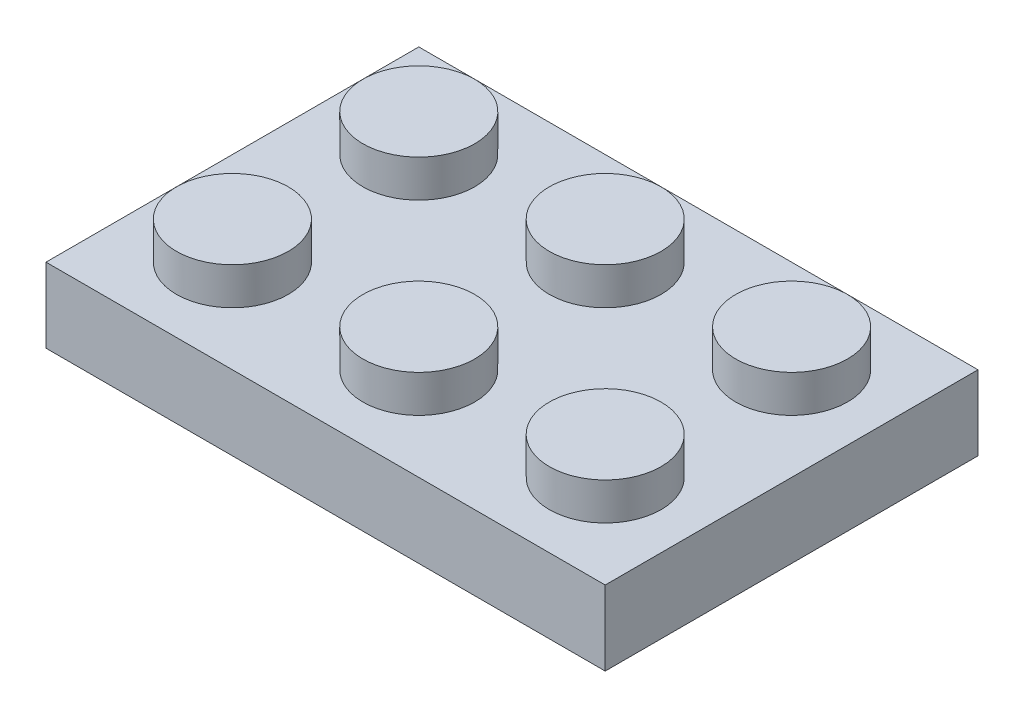
ISO-10303-21;
HEADER;
FILE_DESCRIPTION(('STEP AP214'),'2;1');
FILE_NAME('part.step','',(''),(''),'','','');
FILE_SCHEMA(('AUTOMOTIVE_DESIGN { 1 0 10303 214 1 1 1 1 }'));
ENDSEC;
DATA;
#1=APPLICATION_CONTEXT('core data for automotive mechanical design processes');
#2=APPLICATION_PROTOCOL_DEFINITION('international standard','automotive_design',2000,#1);
#3=PRODUCT_CONTEXT('',#1,'mechanical');
#4=PRODUCT('Part','Part','',(#3));
#5=PRODUCT_RELATED_PRODUCT_CATEGORY('part','',(#4));
#6=PRODUCT_DEFINITION_FORMATION('','',#4);
#7=PRODUCT_DEFINITION_CONTEXT('part definition',#1,'design');
#8=PRODUCT_DEFINITION('design','',#6,#7);
#9=PRODUCT_DEFINITION_SHAPE('','',#8);
#10=(LENGTH_UNIT() NAMED_UNIT(*) SI_UNIT(.MILLI.,.METRE.));
#11=(NAMED_UNIT(*) PLANE_ANGLE_UNIT() SI_UNIT($,.RADIAN.));
#12=(NAMED_UNIT(*) SI_UNIT($,.STERADIAN.) SOLID_ANGLE_UNIT());
#13=UNCERTAINTY_MEASURE_WITH_UNIT(LENGTH_MEASURE(1.E-05),#10,'distance_accuracy_value','');
#14=(GEOMETRIC_REPRESENTATION_CONTEXT(3) GLOBAL_UNCERTAINTY_ASSIGNED_CONTEXT((#13)) GLOBAL_UNIT_ASSIGNED_CONTEXT((#10,
#11,#12)) REPRESENTATION_CONTEXT('',''));
#15=CARTESIAN_POINT('',(0.,0.,0.));
#16=DIRECTION('',(0.,0.,1.));
#17=DIRECTION('',(1.,0.,0.));
#18=AXIS2_PLACEMENT_3D('',#15,#16,#17);
#19=CARTESIAN_POINT('',(20.,1.6,4.));
#20=DIRECTION('',(-1.,0.,0.));
#21=DIRECTION('',(0.,0.,1.));
#22=AXIS2_PLACEMENT_3D('',#19,#20,#21);
#23=PLANE('',#22);
#24=DIRECTION('',(0.,0.,-1.));
#25=VECTOR('',#24,1.);
#26=CARTESIAN_POINT('',(20.,0.,4.));
#27=LINE('',#26,#25);
#28=CARTESIAN_POINT('',(20.,0.,12.));
#29=VERTEX_POINT('',#28);
#30=CARTESIAN_POINT('',(20.,0.,-4.));
#31=VERTEX_POINT('',#30);
#32=EDGE_CURVE('E191',#29,#31,#27,.T.);
#33=ORIENTED_EDGE('',*,*,#32,.T.);
#34=DIRECTION('',(0.,-1.,0.));
#35=VECTOR('',#34,1.);
#36=CARTESIAN_POINT('',(20.,1.6,-4.));
#37=LINE('',#36,#35);
#38=CARTESIAN_POINT('',(20.,3.2,-4.));
#39=VERTEX_POINT('',#38);
#40=EDGE_CURVE('E162',#39,#31,#37,.T.);
#41=ORIENTED_EDGE('',*,*,#40,.F.);
#42=DIRECTION('',(0.,0.,-1.));
#43=VECTOR('',#42,1.);
#44=CARTESIAN_POINT('',(20.,3.2,4.));
#45=LINE('',#44,#43);
#46=CARTESIAN_POINT('',(20.,3.2,12.));
#47=VERTEX_POINT('',#46);
#48=EDGE_CURVE('E11',#47,#39,#45,.T.);
#49=ORIENTED_EDGE('',*,*,#48,.F.);
#50=DIRECTION('',(0.,1.,0.));
#51=VECTOR('',#50,1.);
#52=CARTESIAN_POINT('',(20.,1.6,12.));
#53=LINE('',#52,#51);
#54=EDGE_CURVE('E143',#29,#47,#53,.T.);
#55=ORIENTED_EDGE('',*,*,#54,.F.);
#56=EDGE_LOOP('',(#33,#41,#49,#55));
#57=FACE_BOUND('',#56,.T.);
#58=ADVANCED_FACE('F17',(#57),#23,.F.);
#59=CARTESIAN_POINT('',(8.,3.2,4.));
#60=DIRECTION('',(0.,-1.,0.));
#61=DIRECTION('',(0.,0.,-1.));
#62=AXIS2_PLACEMENT_3D('',#59,#60,#61);
#63=PLANE('',#62);
#64=ORIENTED_EDGE('',*,*,#48,.T.);
#65=DIRECTION('',(1.,0.,0.));
#66=VECTOR('',#65,1.);
#67=CARTESIAN_POINT('',(8.,3.2,-4.));
#68=LINE('',#67,#66);
#69=CARTESIAN_POINT('',(-4.,3.2,-4.));
#70=VERTEX_POINT('',#69);
#71=EDGE_CURVE('E148',#70,#39,#68,.T.);
#72=ORIENTED_EDGE('',*,*,#71,.F.);
#73=DIRECTION('',(0.,0.,-1.));
#74=VECTOR('',#73,1.);
#75=CARTESIAN_POINT('',(-4.,3.2,4.));
#76=LINE('',#75,#74);
#77=CARTESIAN_POINT('',(-4.,3.2,12.));
#78=VERTEX_POINT('',#77);
#79=EDGE_CURVE('E27',#78,#70,#76,.T.);
#80=ORIENTED_EDGE('',*,*,#79,.F.);
#81=DIRECTION('',(-1.,0.,0.));
#82=VECTOR('',#81,1.);
#83=CARTESIAN_POINT('',(8.,3.2,12.));
#84=LINE('',#83,#82);
#85=EDGE_CURVE('E146',#47,#78,#84,.T.);
#86=ORIENTED_EDGE('',*,*,#85,.F.);
#87=EDGE_LOOP('',(#64,#72,#80,#86));
#88=FACE_BOUND('',#87,.T.);
#89=CARTESIAN_POINT('',(0.,3.2,0.));
#90=DIRECTION('',(0.,-1.,0.));
#91=DIRECTION('',(1.,0.,0.));
#92=AXIS2_PLACEMENT_3D('',#89,#90,#91);
#93=CIRCLE('',#92,2.4);
#94=CARTESIAN_POINT('',(-2.4,3.2,0.));
#95=VERTEX_POINT('',#94);
#96=EDGE_CURVE('E147',#95,#95,#93,.T.);
#97=ORIENTED_EDGE('',*,*,#96,.T.);
#98=EDGE_LOOP('',(#97));
#99=FACE_BOUND('',#98,.T.);
#100=CARTESIAN_POINT('',(0.,3.2,8.));
#101=DIRECTION('',(0.,-1.,0.));
#102=DIRECTION('',(1.,0.,0.));
#103=AXIS2_PLACEMENT_3D('',#100,#101,#102);
#104=CIRCLE('',#103,2.4);
#105=CARTESIAN_POINT('',(-2.4,3.2,8.));
#106=VERTEX_POINT('',#105);
#107=EDGE_CURVE('E21',#106,#106,#104,.T.);
#108=ORIENTED_EDGE('',*,*,#107,.T.);
#109=EDGE_LOOP('',(#108));
#110=FACE_BOUND('',#109,.T.);
#111=CARTESIAN_POINT('',(8.,3.2,0.));
#112=DIRECTION('',(0.,-1.,0.));
#113=DIRECTION('',(1.,0.,0.));
#114=AXIS2_PLACEMENT_3D('',#111,#112,#113);
#115=CIRCLE('',#114,2.4);
#116=CARTESIAN_POINT('',(5.6,3.2,0.));
#117=VERTEX_POINT('',#116);
#118=EDGE_CURVE('E171',#117,#117,#115,.T.);
#119=ORIENTED_EDGE('',*,*,#118,.T.);
#120=EDGE_LOOP('',(#119));
#121=FACE_BOUND('',#120,.T.);
#122=CARTESIAN_POINT('',(8.,3.2,8.));
#123=DIRECTION('',(0.,-1.,0.));
#124=DIRECTION('',(1.,0.,0.));
#125=AXIS2_PLACEMENT_3D('',#122,#123,#124);
#126=CIRCLE('',#125,2.4);
#127=CARTESIAN_POINT('',(5.6,3.2,8.));
#128=VERTEX_POINT('',#127);
#129=EDGE_CURVE('E189',#128,#128,#126,.T.);
#130=ORIENTED_EDGE('',*,*,#129,.T.);
#131=EDGE_LOOP('',(#130));
#132=FACE_BOUND('',#131,.T.);
#133=CARTESIAN_POINT('',(16.,3.2,0.));
#134=DIRECTION('',(0.,-1.,0.));
#135=DIRECTION('',(1.,0.,0.));
#136=AXIS2_PLACEMENT_3D('',#133,#134,#135);
#137=CIRCLE('',#136,2.4);
#138=CARTESIAN_POINT('',(13.6,3.2,0.));
#139=VERTEX_POINT('',#138);
#140=EDGE_CURVE('E140',#139,#139,#137,.T.);
#141=ORIENTED_EDGE('',*,*,#140,.T.);
#142=EDGE_LOOP('',(#141));
#143=FACE_BOUND('',#142,.T.);
#144=CARTESIAN_POINT('',(16.,3.2,8.));
#145=DIRECTION('',(0.,-1.,0.));
#146=DIRECTION('',(1.,0.,0.));
#147=AXIS2_PLACEMENT_3D('',#144,#145,#146);
#148=CIRCLE('',#147,2.4);
#149=CARTESIAN_POINT('',(13.6,3.2,8.));
#150=VERTEX_POINT('',#149);
#151=EDGE_CURVE('E205',#150,#150,#148,.T.);
#152=ORIENTED_EDGE('',*,*,#151,.T.);
#153=EDGE_LOOP('',(#152));
#154=FACE_BOUND('',#153,.T.);
#155=ADVANCED_FACE('F235',(#88,#99,#110,#121,#132,#143,#154),#63,.F.);
#156=CARTESIAN_POINT('',(-4.,1.6,4.));
#157=DIRECTION('',(1.,0.,0.));
#158=DIRECTION('',(0.,0.,-1.));
#159=AXIS2_PLACEMENT_3D('',#156,#157,#158);
#160=PLANE('',#159);
#161=ORIENTED_EDGE('',*,*,#79,.T.);
#162=DIRECTION('',(0.,1.,0.));
#163=VECTOR('',#162,1.);
#164=CARTESIAN_POINT('',(-4.,1.6,-4.));
#165=LINE('',#164,#163);
#166=CARTESIAN_POINT('',(-4.,0.,-4.));
#167=VERTEX_POINT('',#166);
#168=EDGE_CURVE('E152',#167,#70,#165,.T.);
#169=ORIENTED_EDGE('',*,*,#168,.F.);
#170=DIRECTION('',(0.,0.,-1.));
#171=VECTOR('',#170,1.);
#172=CARTESIAN_POINT('',(-4.,0.,4.));
#173=LINE('',#172,#171);
#174=CARTESIAN_POINT('',(-4.,0.,12.));
#175=VERTEX_POINT('',#174);
#176=EDGE_CURVE('E151',#175,#167,#173,.T.);
#177=ORIENTED_EDGE('',*,*,#176,.F.);
#178=DIRECTION('',(0.,-1.,0.));
#179=VECTOR('',#178,1.);
#180=CARTESIAN_POINT('',(-4.,1.6,12.));
#181=LINE('',#180,#179);
#182=EDGE_CURVE('E155',#78,#175,#181,.T.);
#183=ORIENTED_EDGE('',*,*,#182,.F.);
#184=EDGE_LOOP('',(#161,#169,#177,#183));
#185=FACE_BOUND('',#184,.T.);
#186=ADVANCED_FACE('F241',(#185),#160,.F.);
#187=CARTESIAN_POINT('',(8.,0.,4.));
#188=DIRECTION('',(0.,1.,0.));
#189=DIRECTION('',(0.,0.,1.));
#190=AXIS2_PLACEMENT_3D('',#187,#188,#189);
#191=PLANE('',#190);
#192=ORIENTED_EDGE('',*,*,#176,.T.);
#193=DIRECTION('',(-1.,0.,0.));
#194=VECTOR('',#193,1.);
#195=CARTESIAN_POINT('',(8.,0.,-4.));
#196=LINE('',#195,#194);
#197=EDGE_CURVE('E159',#31,#167,#196,.T.);
#198=ORIENTED_EDGE('',*,*,#197,.F.);
#199=ORIENTED_EDGE('',*,*,#32,.F.);
#200=DIRECTION('',(1.,0.,0.));
#201=VECTOR('',#200,1.);
#202=CARTESIAN_POINT('',(8.,0.,12.));
#203=LINE('',#202,#201);
#204=EDGE_CURVE('E184',#175,#29,#203,.T.);
#205=ORIENTED_EDGE('',*,*,#204,.F.);
#206=EDGE_LOOP('',(#192,#198,#199,#205));
#207=FACE_BOUND('',#206,.T.);
#208=CARTESIAN_POINT('',(0.,0.,0.));
#209=DIRECTION('',(0.,1.,0.));
#210=DIRECTION('',(1.,0.,0.));
#211=AXIS2_PLACEMENT_3D('',#208,#209,#210);
#212=CIRCLE('',#211,2.4);
#213=CARTESIAN_POINT('',(-2.4,0.,0.));
#214=VERTEX_POINT('',#213);
#215=EDGE_CURVE('E181',#214,#214,#212,.T.);
#216=ORIENTED_EDGE('',*,*,#215,.T.);
#217=EDGE_LOOP('',(#216));
#218=FACE_BOUND('',#217,.T.);
#219=CARTESIAN_POINT('',(0.,0.,8.));
#220=DIRECTION('',(0.,1.,0.));
#221=DIRECTION('',(1.,0.,0.));
#222=AXIS2_PLACEMENT_3D('',#219,#220,#221);
#223=CIRCLE('',#222,2.4);
#224=CARTESIAN_POINT('',(-2.4,0.,8.));
#225=VERTEX_POINT('',#224);
#226=EDGE_CURVE('E163',#225,#225,#223,.T.);
#227=ORIENTED_EDGE('',*,*,#226,.T.);
#228=EDGE_LOOP('',(#227));
#229=FACE_BOUND('',#228,.T.);
#230=CARTESIAN_POINT('',(8.,0.,0.));
#231=DIRECTION('',(0.,1.,0.));
#232=DIRECTION('',(1.,0.,0.));
#233=AXIS2_PLACEMENT_3D('',#230,#231,#232);
#234=CIRCLE('',#233,2.4);
#235=CARTESIAN_POINT('',(5.6,0.,0.));
#236=VERTEX_POINT('',#235);
#237=EDGE_CURVE('E169',#236,#236,#234,.T.);
#238=ORIENTED_EDGE('',*,*,#237,.T.);
#239=EDGE_LOOP('',(#238));
#240=FACE_BOUND('',#239,.T.);
#241=CARTESIAN_POINT('',(8.,0.,8.));
#242=DIRECTION('',(0.,1.,0.));
#243=DIRECTION('',(1.,0.,0.));
#244=AXIS2_PLACEMENT_3D('',#241,#242,#243);
#245=CIRCLE('',#244,2.4);
#246=CARTESIAN_POINT('',(5.6,0.,8.));
#247=VERTEX_POINT('',#246);
#248=EDGE_CURVE('E170',#247,#247,#245,.T.);
#249=ORIENTED_EDGE('',*,*,#248,.T.);
#250=EDGE_LOOP('',(#249));
#251=FACE_BOUND('',#250,.T.);
#252=CARTESIAN_POINT('',(16.,0.,0.));
#253=DIRECTION('',(0.,1.,0.));
#254=DIRECTION('',(1.,0.,0.));
#255=AXIS2_PLACEMENT_3D('',#252,#253,#254);
#256=CIRCLE('',#255,2.4);
#257=CARTESIAN_POINT('',(13.6,0.,0.));
#258=VERTEX_POINT('',#257);
#259=EDGE_CURVE('E132',#258,#258,#256,.T.);
#260=ORIENTED_EDGE('',*,*,#259,.T.);
#261=EDGE_LOOP('',(#260));
#262=FACE_BOUND('',#261,.T.);
#263=CARTESIAN_POINT('',(16.,0.,8.));
#264=DIRECTION('',(0.,1.,0.));
#265=DIRECTION('',(1.,0.,0.));
#266=AXIS2_PLACEMENT_3D('',#263,#264,#265);
#267=CIRCLE('',#266,2.4);
#268=CARTESIAN_POINT('',(13.6,0.,8.));
#269=VERTEX_POINT('',#268);
#270=EDGE_CURVE('E125',#269,#269,#267,.T.);
#271=ORIENTED_EDGE('',*,*,#270,.T.);
#272=EDGE_LOOP('',(#271));
#273=FACE_BOUND('',#272,.T.);
#274=CARTESIAN_POINT('',(4.,0.,4.));
#275=DIRECTION('',(0.,1.,0.));
#276=DIRECTION('',(1.,0.,0.));
#277=AXIS2_PLACEMENT_3D('',#274,#275,#276);
#278=CIRCLE('',#277,2.4);
#279=CARTESIAN_POINT('',(1.6,0.,4.));
#280=VERTEX_POINT('',#279);
#281=EDGE_CURVE('E134',#280,#280,#278,.T.);
#282=ORIENTED_EDGE('',*,*,#281,.T.);
#283=EDGE_LOOP('',(#282));
#284=FACE_BOUND('',#283,.T.);
#285=CARTESIAN_POINT('',(12.,0.,4.));
#286=DIRECTION('',(0.,1.,0.));
#287=DIRECTION('',(1.,0.,0.));
#288=AXIS2_PLACEMENT_3D('',#285,#286,#287);
#289=CIRCLE('',#288,2.4);
#290=CARTESIAN_POINT('',(9.6,0.,4.));
#291=VERTEX_POINT('',#290);
#292=EDGE_CURVE('E176',#291,#291,#289,.T.);
#293=ORIENTED_EDGE('',*,*,#292,.T.);
#294=EDGE_LOOP('',(#293));
#295=FACE_BOUND('',#294,.T.);
#296=ADVANCED_FACE('F126',(#207,#218,#229,#240,#251,#262,#273,#284,#295),#191,.F.);
#297=CARTESIAN_POINT('',(8.,1.6,-4.));
#298=DIRECTION('',(0.,0.,1.));
#299=DIRECTION('',(1.,0.,0.));
#300=AXIS2_PLACEMENT_3D('',#297,#298,#299);
#301=PLANE('',#300);
#302=ORIENTED_EDGE('',*,*,#40,.T.);
#303=ORIENTED_EDGE('',*,*,#197,.T.);
#304=ORIENTED_EDGE('',*,*,#168,.T.);
#305=ORIENTED_EDGE('',*,*,#71,.T.);
#306=EDGE_LOOP('',(#302,#303,#304,#305));
#307=FACE_BOUND('',#306,.T.);
#308=ADVANCED_FACE('F263',(#307),#301,.F.);
#309=CARTESIAN_POINT('',(8.,1.6,12.));
#310=DIRECTION('',(0.,0.,1.));
#311=DIRECTION('',(1.,0.,0.));
#312=AXIS2_PLACEMENT_3D('',#309,#310,#311);
#313=PLANE('',#312);
#314=ORIENTED_EDGE('',*,*,#54,.T.);
#315=ORIENTED_EDGE('',*,*,#85,.T.);
#316=ORIENTED_EDGE('',*,*,#182,.T.);
#317=ORIENTED_EDGE('',*,*,#204,.T.);
#318=EDGE_LOOP('',(#314,#315,#316,#317));
#319=FACE_BOUND('',#318,.T.);
#320=ADVANCED_FACE('F266',(#319),#313,.T.);
#321=CARTESIAN_POINT('',(0.,4.8,0.));
#322=DIRECTION('',(0.,1.,0.));
#323=DIRECTION('',(1.,0.,0.));
#324=AXIS2_PLACEMENT_3D('',#321,#322,#323);
#325=PLANE('',#324);
#326=CARTESIAN_POINT('',(0.,4.8,0.));
#327=DIRECTION('',(0.,1.,0.));
#328=DIRECTION('',(1.,0.,0.));
#329=AXIS2_PLACEMENT_3D('',#326,#327,#328);
#330=CIRCLE('',#329,2.4);
#331=CARTESIAN_POINT('',(2.4,4.8,0.));
#332=VERTEX_POINT('',#331);
#333=EDGE_CURVE('E183',#332,#332,#330,.T.);
#334=ORIENTED_EDGE('',*,*,#333,.T.);
#335=EDGE_LOOP('',(#334));
#336=FACE_BOUND('',#335,.T.);
#337=ADVANCED_FACE('F261',(#336),#325,.T.);
#338=CARTESIAN_POINT('',(0.,3.75,0.));
#339=DIRECTION('',(0.,-1.,0.));
#340=DIRECTION('',(1.,0.,0.));
#341=AXIS2_PLACEMENT_3D('',#338,#339,#340);
#342=CYLINDRICAL_SURFACE('',#341,2.4);
#343=ORIENTED_EDGE('',*,*,#96,.F.);
#344=EDGE_LOOP('',(#343));
#345=FACE_BOUND('',#344,.T.);
#346=ORIENTED_EDGE('',*,*,#333,.F.);
#347=EDGE_LOOP('',(#346));
#348=FACE_BOUND('',#347,.T.);
#349=ADVANCED_FACE('F257',(#345,#348),#342,.T.);
#350=CARTESIAN_POINT('',(0.,4.8,8.));
#351=DIRECTION('',(0.,1.,0.));
#352=DIRECTION('',(1.,0.,0.));
#353=AXIS2_PLACEMENT_3D('',#350,#351,#352);
#354=PLANE('',#353);
#355=CARTESIAN_POINT('',(0.,4.8,8.));
#356=DIRECTION('',(0.,1.,0.));
#357=DIRECTION('',(1.,0.,0.));
#358=AXIS2_PLACEMENT_3D('',#355,#356,#357);
#359=CIRCLE('',#358,2.4);
#360=CARTESIAN_POINT('',(2.4,4.8,8.));
#361=VERTEX_POINT('',#360);
#362=EDGE_CURVE('E173',#361,#361,#359,.T.);
#363=ORIENTED_EDGE('',*,*,#362,.T.);
#364=EDGE_LOOP('',(#363));
#365=FACE_BOUND('',#364,.T.);
#366=ADVANCED_FACE('F260',(#365),#354,.T.);
#367=CARTESIAN_POINT('',(0.,3.75,8.));
#368=DIRECTION('',(0.,-1.,0.));
#369=DIRECTION('',(1.,0.,0.));
#370=AXIS2_PLACEMENT_3D('',#367,#368,#369);
#371=CYLINDRICAL_SURFACE('',#370,2.4);
#372=ORIENTED_EDGE('',*,*,#107,.F.);
#373=EDGE_LOOP('',(#372));
#374=FACE_BOUND('',#373,.T.);
#375=ORIENTED_EDGE('',*,*,#362,.F.);
#376=EDGE_LOOP('',(#375));
#377=FACE_BOUND('',#376,.T.);
#378=ADVANCED_FACE('F230',(#374,#377),#371,.T.);
#379=CARTESIAN_POINT('',(8.,4.8,0.));
#380=DIRECTION('',(0.,1.,0.));
#381=DIRECTION('',(1.,0.,0.));
#382=AXIS2_PLACEMENT_3D('',#379,#380,#381);
#383=PLANE('',#382);
#384=CARTESIAN_POINT('',(8.,4.8,0.));
#385=DIRECTION('',(0.,1.,0.));
#386=DIRECTION('',(1.,0.,0.));
#387=AXIS2_PLACEMENT_3D('',#384,#385,#386);
#388=CIRCLE('',#387,2.4);
#389=CARTESIAN_POINT('',(10.4,4.8,0.));
#390=VERTEX_POINT('',#389);
#391=EDGE_CURVE('E174',#390,#390,#388,.T.);
#392=ORIENTED_EDGE('',*,*,#391,.T.);
#393=EDGE_LOOP('',(#392));
#394=FACE_BOUND('',#393,.T.);
#395=ADVANCED_FACE('F214',(#394),#383,.T.);
#396=CARTESIAN_POINT('',(8.,3.75,0.));
#397=DIRECTION('',(0.,-1.,0.));
#398=DIRECTION('',(1.,0.,0.));
#399=AXIS2_PLACEMENT_3D('',#396,#397,#398);
#400=CYLINDRICAL_SURFACE('',#399,2.4);
#401=ORIENTED_EDGE('',*,*,#118,.F.);
#402=EDGE_LOOP('',(#401));
#403=FACE_BOUND('',#402,.T.);
#404=ORIENTED_EDGE('',*,*,#391,.F.);
#405=EDGE_LOOP('',(#404));
#406=FACE_BOUND('',#405,.T.);
#407=ADVANCED_FACE('F217',(#403,#406),#400,.T.);
#408=CARTESIAN_POINT('',(8.,4.8,8.));
#409=DIRECTION('',(0.,1.,0.));
#410=DIRECTION('',(1.,0.,0.));
#411=AXIS2_PLACEMENT_3D('',#408,#409,#410);
#412=PLANE('',#411);
#413=CARTESIAN_POINT('',(8.,4.8,8.));
#414=DIRECTION('',(0.,1.,0.));
#415=DIRECTION('',(1.,0.,0.));
#416=AXIS2_PLACEMENT_3D('',#413,#414,#415);
#417=CIRCLE('',#416,2.4);
#418=CARTESIAN_POINT('',(10.4,4.8,8.));
#419=VERTEX_POINT('',#418);
#420=EDGE_CURVE('E142',#419,#419,#417,.T.);
#421=ORIENTED_EDGE('',*,*,#420,.T.);
#422=EDGE_LOOP('',(#421));
#423=FACE_BOUND('',#422,.T.);
#424=ADVANCED_FACE('F219',(#423),#412,.T.);
#425=CARTESIAN_POINT('',(8.,3.75,8.));
#426=DIRECTION('',(0.,-1.,0.));
#427=DIRECTION('',(1.,0.,0.));
#428=AXIS2_PLACEMENT_3D('',#425,#426,#427);
#429=CYLINDRICAL_SURFACE('',#428,2.4);
#430=ORIENTED_EDGE('',*,*,#129,.F.);
#431=EDGE_LOOP('',(#430));
#432=FACE_BOUND('',#431,.T.);
#433=ORIENTED_EDGE('',*,*,#420,.F.);
#434=EDGE_LOOP('',(#433));
#435=FACE_BOUND('',#434,.T.);
#436=ADVANCED_FACE('F227',(#432,#435),#429,.T.);
#437=CARTESIAN_POINT('',(16.,4.8,0.));
#438=DIRECTION('',(0.,1.,0.));
#439=DIRECTION('',(1.,0.,0.));
#440=AXIS2_PLACEMENT_3D('',#437,#438,#439);
#441=PLANE('',#440);
#442=CARTESIAN_POINT('',(16.,4.8,0.));
#443=DIRECTION('',(0.,1.,0.));
#444=DIRECTION('',(1.,0.,0.));
#445=AXIS2_PLACEMENT_3D('',#442,#443,#444);
#446=CIRCLE('',#445,2.4);
#447=CARTESIAN_POINT('',(18.4,4.8,0.));
#448=VERTEX_POINT('',#447);
#449=EDGE_CURVE('E138',#448,#448,#446,.T.);
#450=ORIENTED_EDGE('',*,*,#449,.T.);
#451=EDGE_LOOP('',(#450));
#452=FACE_BOUND('',#451,.T.);
#453=ADVANCED_FACE('F19',(#452),#441,.T.);
#454=CARTESIAN_POINT('',(16.,3.75,0.));
#455=DIRECTION('',(0.,-1.,0.));
#456=DIRECTION('',(1.,0.,0.));
#457=AXIS2_PLACEMENT_3D('',#454,#455,#456);
#458=CYLINDRICAL_SURFACE('',#457,2.4);
#459=ORIENTED_EDGE('',*,*,#140,.F.);
#460=EDGE_LOOP('',(#459));
#461=FACE_BOUND('',#460,.T.);
#462=ORIENTED_EDGE('',*,*,#449,.F.);
#463=EDGE_LOOP('',(#462));
#464=FACE_BOUND('',#463,.T.);
#465=ADVANCED_FACE('F252',(#461,#464),#458,.T.);
#466=CARTESIAN_POINT('',(16.,4.8,8.));
#467=DIRECTION('',(0.,1.,0.));
#468=DIRECTION('',(1.,0.,0.));
#469=AXIS2_PLACEMENT_3D('',#466,#467,#468);
#470=PLANE('',#469);
#471=CARTESIAN_POINT('',(16.,4.8,8.));
#472=DIRECTION('',(0.,1.,0.));
#473=DIRECTION('',(1.,0.,0.));
#474=AXIS2_PLACEMENT_3D('',#471,#472,#473);
#475=CIRCLE('',#474,2.4);
#476=CARTESIAN_POINT('',(18.4,4.8,8.));
#477=VERTEX_POINT('',#476);
#478=EDGE_CURVE('E202',#477,#477,#475,.T.);
#479=ORIENTED_EDGE('',*,*,#478,.T.);
#480=EDGE_LOOP('',(#479));
#481=FACE_BOUND('',#480,.T.);
#482=ADVANCED_FACE('F255',(#481),#470,.T.);
#483=CARTESIAN_POINT('',(16.,3.75,8.));
#484=DIRECTION('',(0.,-1.,0.));
#485=DIRECTION('',(1.,0.,0.));
#486=AXIS2_PLACEMENT_3D('',#483,#484,#485);
#487=CYLINDRICAL_SURFACE('',#486,2.4);
#488=ORIENTED_EDGE('',*,*,#151,.F.);
#489=EDGE_LOOP('',(#488));
#490=FACE_BOUND('',#489,.T.);
#491=ORIENTED_EDGE('',*,*,#478,.F.);
#492=EDGE_LOOP('',(#491));
#493=FACE_BOUND('',#492,.T.);
#494=ADVANCED_FACE('F293',(#490,#493),#487,.T.);
#495=CARTESIAN_POINT('',(0.,1.6,0.));
#496=DIRECTION('',(0.,1.,0.));
#497=DIRECTION('',(1.,0.,0.));
#498=AXIS2_PLACEMENT_3D('',#495,#496,#497);
#499=PLANE('',#498);
#500=CARTESIAN_POINT('',(0.,1.6,0.));
#501=DIRECTION('',(0.,1.,0.));
#502=DIRECTION('',(1.,0.,0.));
#503=AXIS2_PLACEMENT_3D('',#500,#501,#502);
#504=CIRCLE('',#503,2.4);
#505=CARTESIAN_POINT('',(2.4,1.6,0.));
#506=VERTEX_POINT('',#505);
#507=EDGE_CURVE('E206',#506,#506,#504,.T.);
#508=ORIENTED_EDGE('',*,*,#507,.F.);
#509=EDGE_LOOP('',(#508));
#510=FACE_BOUND('',#509,.T.);
#511=ADVANCED_FACE('F290',(#510),#499,.F.);
#512=CARTESIAN_POINT('',(0.,0.55,0.));
#513=DIRECTION('',(0.,-1.,0.));
#514=DIRECTION('',(1.,0.,0.));
#515=AXIS2_PLACEMENT_3D('',#512,#513,#514);
#516=CYLINDRICAL_SURFACE('',#515,2.4);
#517=ORIENTED_EDGE('',*,*,#507,.T.);
#518=EDGE_LOOP('',(#517));
#519=FACE_BOUND('',#518,.T.);
#520=ORIENTED_EDGE('',*,*,#215,.F.);
#521=EDGE_LOOP('',(#520));
#522=FACE_BOUND('',#521,.T.);
#523=ADVANCED_FACE('F288',(#519,#522),#516,.F.);
#524=CARTESIAN_POINT('',(0.,1.6,8.));
#525=DIRECTION('',(0.,1.,0.));
#526=DIRECTION('',(1.,0.,0.));
#527=AXIS2_PLACEMENT_3D('',#524,#525,#526);
#528=PLANE('',#527);
#529=CARTESIAN_POINT('',(0.,1.6,8.));
#530=DIRECTION('',(0.,1.,0.));
#531=DIRECTION('',(1.,0.,0.));
#532=AXIS2_PLACEMENT_3D('',#529,#530,#531);
#533=CIRCLE('',#532,2.4);
#534=CARTESIAN_POINT('',(2.4,1.6,8.));
#535=VERTEX_POINT('',#534);
#536=EDGE_CURVE('E165',#535,#535,#533,.T.);
#537=ORIENTED_EDGE('',*,*,#536,.F.);
#538=EDGE_LOOP('',(#537));
#539=FACE_BOUND('',#538,.T.);
#540=ADVANCED_FACE('F284',(#539),#528,.F.);
#541=CARTESIAN_POINT('',(0.,0.55,8.));
#542=DIRECTION('',(0.,-1.,0.));
#543=DIRECTION('',(1.,0.,0.));
#544=AXIS2_PLACEMENT_3D('',#541,#542,#543);
#545=CYLINDRICAL_SURFACE('',#544,2.4);
#546=ORIENTED_EDGE('',*,*,#536,.T.);
#547=EDGE_LOOP('',(#546));
#548=FACE_BOUND('',#547,.T.);
#549=ORIENTED_EDGE('',*,*,#226,.F.);
#550=EDGE_LOOP('',(#549));
#551=FACE_BOUND('',#550,.T.);
#552=ADVANCED_FACE('F287',(#548,#551),#545,.F.);
#553=CARTESIAN_POINT('',(8.,1.6,0.));
#554=DIRECTION('',(0.,1.,0.));
#555=DIRECTION('',(1.,0.,0.));
#556=AXIS2_PLACEMENT_3D('',#553,#554,#555);
#557=PLANE('',#556);
#558=CARTESIAN_POINT('',(8.,1.6,0.));
#559=DIRECTION('',(0.,1.,0.));
#560=DIRECTION('',(1.,0.,0.));
#561=AXIS2_PLACEMENT_3D('',#558,#559,#560);
#562=CIRCLE('',#561,2.4);
#563=CARTESIAN_POINT('',(10.4,1.6,0.));
#564=VERTEX_POINT('',#563);
#565=EDGE_CURVE('E166',#564,#564,#562,.T.);
#566=ORIENTED_EDGE('',*,*,#565,.F.);
#567=EDGE_LOOP('',(#566));
#568=FACE_BOUND('',#567,.T.);
#569=ADVANCED_FACE('F302',(#568),#557,.F.);
#570=CARTESIAN_POINT('',(8.,0.55,0.));
#571=DIRECTION('',(0.,-1.,0.));
#572=DIRECTION('',(1.,0.,0.));
#573=AXIS2_PLACEMENT_3D('',#570,#571,#572);
#574=CYLINDRICAL_SURFACE('',#573,2.4);
#575=ORIENTED_EDGE('',*,*,#565,.T.);
#576=EDGE_LOOP('',(#575));
#577=FACE_BOUND('',#576,.T.);
#578=ORIENTED_EDGE('',*,*,#237,.F.);
#579=EDGE_LOOP('',(#578));
#580=FACE_BOUND('',#579,.T.);
#581=ADVANCED_FACE('F297',(#577,#580),#574,.F.);
#582=CARTESIAN_POINT('',(8.,1.6,8.));
#583=DIRECTION('',(0.,1.,0.));
#584=DIRECTION('',(1.,0.,0.));
#585=AXIS2_PLACEMENT_3D('',#582,#583,#584);
#586=PLANE('',#585);
#587=CARTESIAN_POINT('',(8.,1.6,8.));
#588=DIRECTION('',(0.,1.,0.));
#589=DIRECTION('',(1.,0.,0.));
#590=AXIS2_PLACEMENT_3D('',#587,#588,#589);
#591=CIRCLE('',#590,2.4);
#592=CARTESIAN_POINT('',(10.4,1.6,8.));
#593=VERTEX_POINT('',#592);
#594=EDGE_CURVE('E167',#593,#593,#591,.T.);
#595=ORIENTED_EDGE('',*,*,#594,.F.);
#596=EDGE_LOOP('',(#595));
#597=FACE_BOUND('',#596,.T.);
#598=ADVANCED_FACE('F282',(#597),#586,.F.);
#599=CARTESIAN_POINT('',(8.,0.55,8.));
#600=DIRECTION('',(0.,-1.,0.));
#601=DIRECTION('',(1.,0.,0.));
#602=AXIS2_PLACEMENT_3D('',#599,#600,#601);
#603=CYLINDRICAL_SURFACE('',#602,2.4);
#604=ORIENTED_EDGE('',*,*,#594,.T.);
#605=EDGE_LOOP('',(#604));
#606=FACE_BOUND('',#605,.T.);
#607=ORIENTED_EDGE('',*,*,#248,.F.);
#608=EDGE_LOOP('',(#607));
#609=FACE_BOUND('',#608,.T.);
#610=ADVANCED_FACE('F278',(#606,#609),#603,.F.);
#611=CARTESIAN_POINT('',(16.,1.6,0.));
#612=DIRECTION('',(0.,1.,0.));
#613=DIRECTION('',(1.,0.,0.));
#614=AXIS2_PLACEMENT_3D('',#611,#612,#613);
#615=PLANE('',#614);
#616=CARTESIAN_POINT('',(16.,1.6,0.));
#617=DIRECTION('',(0.,1.,0.));
#618=DIRECTION('',(1.,0.,0.));
#619=AXIS2_PLACEMENT_3D('',#616,#617,#618);
#620=CIRCLE('',#619,2.4);
#621=CARTESIAN_POINT('',(18.4,1.6,0.));
#622=VERTEX_POINT('',#621);
#623=EDGE_CURVE('E158',#622,#622,#620,.T.);
#624=ORIENTED_EDGE('',*,*,#623,.F.);
#625=EDGE_LOOP('',(#624));
#626=FACE_BOUND('',#625,.T.);
#627=ADVANCED_FACE('F281',(#626),#615,.F.);
#628=CARTESIAN_POINT('',(16.,0.55,0.));
#629=DIRECTION('',(0.,-1.,0.));
#630=DIRECTION('',(1.,0.,0.));
#631=AXIS2_PLACEMENT_3D('',#628,#629,#630);
#632=CYLINDRICAL_SURFACE('',#631,2.4);
#633=ORIENTED_EDGE('',*,*,#623,.T.);
#634=EDGE_LOOP('',(#633));
#635=FACE_BOUND('',#634,.T.);
#636=ORIENTED_EDGE('',*,*,#259,.F.);
#637=EDGE_LOOP('',(#636));
#638=FACE_BOUND('',#637,.T.);
#639=ADVANCED_FACE('F333',(#635,#638),#632,.F.);
#640=CARTESIAN_POINT('',(16.,1.6,8.));
#641=DIRECTION('',(0.,1.,0.));
#642=DIRECTION('',(1.,0.,0.));
#643=AXIS2_PLACEMENT_3D('',#640,#641,#642);
#644=PLANE('',#643);
#645=CARTESIAN_POINT('',(16.,1.6,8.));
#646=DIRECTION('',(0.,1.,0.));
#647=DIRECTION('',(1.,0.,0.));
#648=AXIS2_PLACEMENT_3D('',#645,#646,#647);
#649=CIRCLE('',#648,2.4);
#650=CARTESIAN_POINT('',(18.4,1.6,8.));
#651=VERTEX_POINT('',#650);
#652=EDGE_CURVE('E129',#651,#651,#649,.T.);
#653=ORIENTED_EDGE('',*,*,#652,.F.);
#654=EDGE_LOOP('',(#653));
#655=FACE_BOUND('',#654,.T.);
#656=ADVANCED_FACE('F309',(#655),#644,.F.);
#657=CARTESIAN_POINT('',(16.,0.55,8.));
#658=DIRECTION('',(0.,-1.,0.));
#659=DIRECTION('',(1.,0.,0.));
#660=AXIS2_PLACEMENT_3D('',#657,#658,#659);
#661=CYLINDRICAL_SURFACE('',#660,2.4);
#662=ORIENTED_EDGE('',*,*,#652,.T.);
#663=EDGE_LOOP('',(#662));
#664=FACE_BOUND('',#663,.T.);
#665=ORIENTED_EDGE('',*,*,#270,.F.);
#666=EDGE_LOOP('',(#665));
#667=FACE_BOUND('',#666,.T.);
#668=ADVANCED_FACE('F306',(#664,#667),#661,.F.);
#669=CARTESIAN_POINT('',(4.,1.6,4.));
#670=DIRECTION('',(0.,1.,0.));
#671=DIRECTION('',(1.,0.,0.));
#672=AXIS2_PLACEMENT_3D('',#669,#670,#671);
#673=PLANE('',#672);
#674=CARTESIAN_POINT('',(4.,1.6,4.));
#675=DIRECTION('',(0.,1.,0.));
#676=DIRECTION('',(1.,0.,0.));
#677=AXIS2_PLACEMENT_3D('',#674,#675,#676);
#678=CIRCLE('',#677,2.4);
#679=CARTESIAN_POINT('',(6.4,1.6,4.));
#680=VERTEX_POINT('',#679);
#681=EDGE_CURVE('E130',#680,#680,#678,.T.);
#682=ORIENTED_EDGE('',*,*,#681,.F.);
#683=EDGE_LOOP('',(#682));
#684=FACE_BOUND('',#683,.T.);
#685=ADVANCED_FACE('F271',(#684),#673,.F.);
#686=CARTESIAN_POINT('',(4.,0.55,4.));
#687=DIRECTION('',(0.,-1.,0.));
#688=DIRECTION('',(1.,0.,0.));
#689=AXIS2_PLACEMENT_3D('',#686,#687,#688);
#690=CYLINDRICAL_SURFACE('',#689,2.4);
#691=ORIENTED_EDGE('',*,*,#681,.T.);
#692=EDGE_LOOP('',(#691));
#693=FACE_BOUND('',#692,.T.);
#694=ORIENTED_EDGE('',*,*,#281,.F.);
#695=EDGE_LOOP('',(#694));
#696=FACE_BOUND('',#695,.T.);
#697=ADVANCED_FACE('F268',(#693,#696),#690,.F.);
#698=CARTESIAN_POINT('',(12.,1.6,4.));
#699=DIRECTION('',(0.,1.,0.));
#700=DIRECTION('',(1.,0.,0.));
#701=AXIS2_PLACEMENT_3D('',#698,#699,#700);
#702=PLANE('',#701);
#703=CARTESIAN_POINT('',(12.,1.6,4.));
#704=DIRECTION('',(0.,1.,0.));
#705=DIRECTION('',(1.,0.,0.));
#706=AXIS2_PLACEMENT_3D('',#703,#704,#705);
#707=CIRCLE('',#706,2.4);
#708=CARTESIAN_POINT('',(14.4,1.6,4.));
#709=VERTEX_POINT('',#708);
#710=EDGE_CURVE('E178',#709,#709,#707,.T.);
#711=ORIENTED_EDGE('',*,*,#710,.F.);
#712=EDGE_LOOP('',(#711));
#713=FACE_BOUND('',#712,.T.);
#714=ADVANCED_FACE('F250',(#713),#702,.F.);
#715=CARTESIAN_POINT('',(12.,0.55,4.));
#716=DIRECTION('',(0.,-1.,0.));
#717=DIRECTION('',(1.,0.,0.));
#718=AXIS2_PLACEMENT_3D('',#715,#716,#717);
#719=CYLINDRICAL_SURFACE('',#718,2.4);
#720=ORIENTED_EDGE('',*,*,#710,.T.);
#721=EDGE_LOOP('',(#720));
#722=FACE_BOUND('',#721,.T.);
#723=ORIENTED_EDGE('',*,*,#292,.F.);
#724=EDGE_LOOP('',(#723));
#725=FACE_BOUND('',#724,.T.);
#726=ADVANCED_FACE('F247',(#722,#725),#719,.F.);
#727=CLOSED_SHELL('',(#58,#155,#186,#296,#308,#320,#337,#349,#366,#378,#395,#407,#424,#436,#453,
#465,#482,#494,#511,#523,#540,#552,#569,#581,#598,#610,#627,#639,#656,#668,#685,#697,#714,#726));
#728=MANIFOLD_SOLID_BREP('B1',#727);
#729=ADVANCED_BREP_SHAPE_REPRESENTATION('',(#18,#728),#14);
#730=SHAPE_DEFINITION_REPRESENTATION(#9,#729);
ENDSEC;
END-ISO-10303-21;
